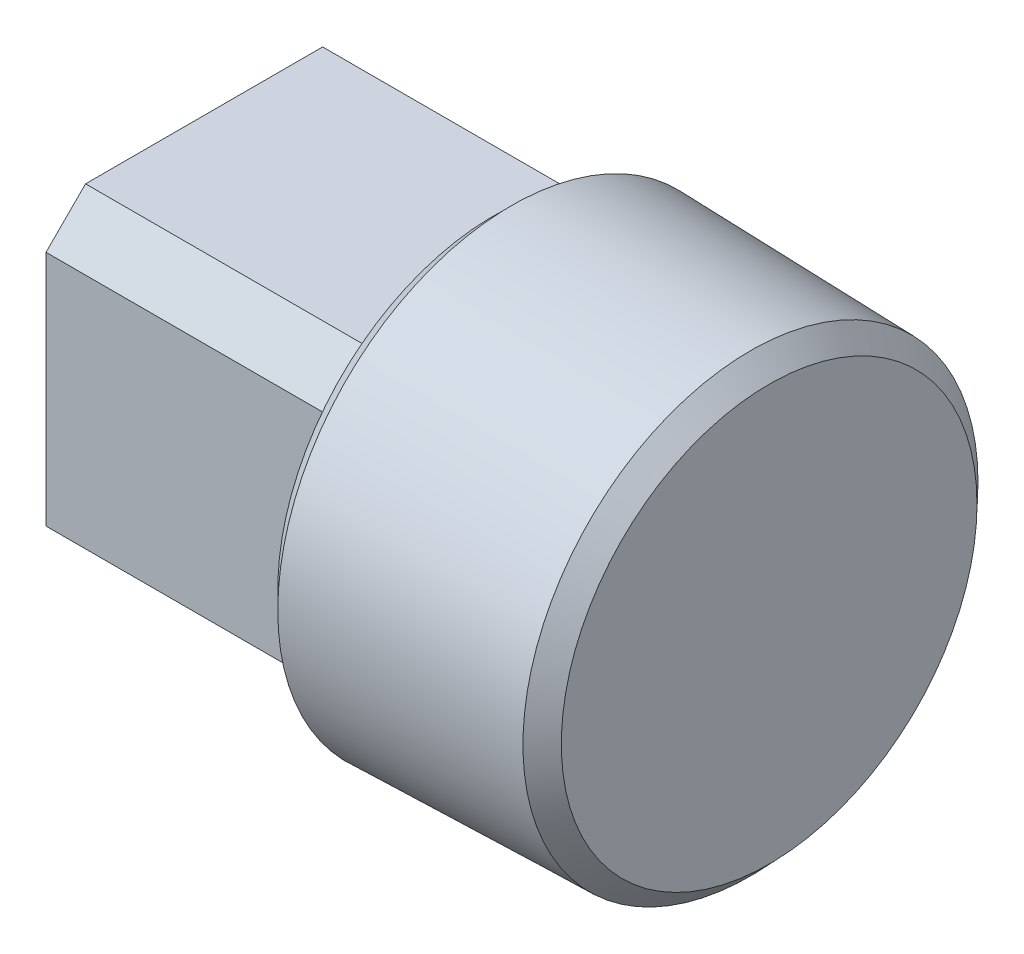
ISO-10303-21;
HEADER;
FILE_DESCRIPTION(('STEP AP214'),'2;1');
FILE_NAME('part.step','',(''),(''),'','','');
FILE_SCHEMA(('AUTOMOTIVE_DESIGN { 1 0 10303 214 1 1 1 1 }'));
ENDSEC;
DATA;
#1=APPLICATION_CONTEXT('core data for automotive mechanical design processes');
#2=APPLICATION_PROTOCOL_DEFINITION('international standard','automotive_design',2000,#1);
#3=PRODUCT_CONTEXT('',#1,'mechanical');
#4=PRODUCT('Part','Part','',(#3));
#5=PRODUCT_RELATED_PRODUCT_CATEGORY('part','',(#4));
#6=PRODUCT_DEFINITION_FORMATION('','',#4);
#7=PRODUCT_DEFINITION_CONTEXT('part definition',#1,'design');
#8=PRODUCT_DEFINITION('design','',#6,#7);
#9=PRODUCT_DEFINITION_SHAPE('','',#8);
#10=(LENGTH_UNIT() NAMED_UNIT(*) SI_UNIT(.MILLI.,.METRE.));
#11=(NAMED_UNIT(*) PLANE_ANGLE_UNIT() SI_UNIT($,.RADIAN.));
#12=(NAMED_UNIT(*) SI_UNIT($,.STERADIAN.) SOLID_ANGLE_UNIT());
#13=UNCERTAINTY_MEASURE_WITH_UNIT(LENGTH_MEASURE(1.E-05),#10,'distance_accuracy_value','');
#14=(GEOMETRIC_REPRESENTATION_CONTEXT(3) GLOBAL_UNCERTAINTY_ASSIGNED_CONTEXT((#13)) GLOBAL_UNIT_ASSIGNED_CONTEXT((#10,
#11,#12)) REPRESENTATION_CONTEXT('',''));
#15=CARTESIAN_POINT('',(0.,0.,0.));
#16=DIRECTION('',(0.,0.,1.));
#17=DIRECTION('',(1.,0.,0.));
#18=AXIS2_PLACEMENT_3D('',#15,#16,#17);
#19=CARTESIAN_POINT('',(0.253999999999999,0.,0.));
#20=DIRECTION('',(1.,0.,0.));
#21=DIRECTION('',(0.,0.,-1.));
#22=AXIS2_PLACEMENT_3D('',#19,#20,#21);
#23=PLANE('',#22);
#24=CARTESIAN_POINT('',(0.253999999999999,0.,0.));
#25=DIRECTION('',(1.,0.,0.));
#26=DIRECTION('',(0.,0.,-1.));
#27=AXIS2_PLACEMENT_3D('',#24,#25,#26);
#28=CIRCLE('',#27,8.13964463166595);
#29=CARTESIAN_POINT('',(0.253999999999999,0.,-8.13964463166595));
#30=VERTEX_POINT('',#29);
#31=EDGE_CURVE('E40',#30,#30,#28,.F.);
#32=ORIENTED_EDGE('',*,*,#31,.T.);
#33=EDGE_LOOP('',(#32));
#34=FACE_BOUND('',#33,.T.);
#35=DIRECTION('',(0.,0.,1.));
#36=VECTOR('',#35,1.);
#37=CARTESIAN_POINT('',(0.253999999999999,-5.969,-5.969));
#38=LINE('',#37,#36);
#39=CARTESIAN_POINT('',(0.253999999999999,-5.969,-4.47675));
#40=VERTEX_POINT('',#39);
#41=CARTESIAN_POINT('',(0.253999999999999,-5.969,4.47675));
#42=VERTEX_POINT('',#41);
#43=EDGE_CURVE('E124',#40,#42,#38,.T.);
#44=ORIENTED_EDGE('',*,*,#43,.F.);
#45=DIRECTION('',(0.,0.707106781186547,-0.707106781186548));
#46=VECTOR('',#45,1.);
#47=CARTESIAN_POINT('',(0.253999999999999,-4.47675,-5.969));
#48=LINE('',#47,#46);
#49=CARTESIAN_POINT('',(0.253999999999999,-4.47675,-5.969));
#50=VERTEX_POINT('',#49);
#51=EDGE_CURVE('E166',#40,#50,#48,.T.);
#52=ORIENTED_EDGE('',*,*,#51,.T.);
#53=DIRECTION('',(0.,-1.,0.));
#54=VECTOR('',#53,1.);
#55=CARTESIAN_POINT('',(0.253999999999999,-5.969,-5.969));
#56=LINE('',#55,#54);
#57=CARTESIAN_POINT('',(0.253999999999999,4.47675,-5.969));
#58=VERTEX_POINT('',#57);
#59=EDGE_CURVE('E11',#58,#50,#56,.T.);
#60=ORIENTED_EDGE('',*,*,#59,.F.);
#61=DIRECTION('',(0.,0.707106781186547,0.707106781186547));
#62=VECTOR('',#61,1.);
#63=CARTESIAN_POINT('',(0.253999999999999,4.47675,-5.969));
#64=LINE('',#63,#62);
#65=CARTESIAN_POINT('',(0.253999999999999,5.969,-4.47675));
#66=VERTEX_POINT('',#65);
#67=EDGE_CURVE('E121',#58,#66,#64,.T.);
#68=ORIENTED_EDGE('',*,*,#67,.T.);
#69=DIRECTION('',(0.,0.,-1.));
#70=VECTOR('',#69,1.);
#71=CARTESIAN_POINT('',(0.253999999999999,5.969,-5.969));
#72=LINE('',#71,#70);
#73=CARTESIAN_POINT('',(0.253999999999999,5.969,4.47675));
#74=VERTEX_POINT('',#73);
#75=EDGE_CURVE('E45',#74,#66,#72,.T.);
#76=ORIENTED_EDGE('',*,*,#75,.F.);
#77=DIRECTION('',(0.,-0.707106781186547,0.707106781186548));
#78=VECTOR('',#77,1.);
#79=CARTESIAN_POINT('',(0.253999999999999,5.969,4.47675));
#80=LINE('',#79,#78);
#81=CARTESIAN_POINT('',(0.253999999999999,4.47675,5.969));
#82=VERTEX_POINT('',#81);
#83=EDGE_CURVE('E101',#74,#82,#80,.T.);
#84=ORIENTED_EDGE('',*,*,#83,.T.);
#85=DIRECTION('',(0.,1.,0.));
#86=VECTOR('',#85,1.);
#87=CARTESIAN_POINT('',(0.253999999999999,-5.969,5.969));
#88=LINE('',#87,#86);
#89=CARTESIAN_POINT('',(0.253999999999999,-4.47675,5.969));
#90=VERTEX_POINT('',#89);
#91=EDGE_CURVE('E122',#90,#82,#88,.T.);
#92=ORIENTED_EDGE('',*,*,#91,.F.);
#93=DIRECTION('',(0.,-0.707106781186547,-0.707106781186548));
#94=VECTOR('',#93,1.);
#95=CARTESIAN_POINT('',(0.253999999999999,-4.47675,5.969));
#96=LINE('',#95,#94);
#97=EDGE_CURVE('E175',#90,#42,#96,.T.);
#98=ORIENTED_EDGE('',*,*,#97,.T.);
#99=EDGE_LOOP('',(#44,#52,#60,#68,#76,#84,#92,#98));
#100=FACE_BOUND('',#99,.T.);
#101=ADVANCED_FACE('F36',(#34,#100),#23,.F.);
#102=CARTESIAN_POINT('',(10.668,0.,0.));
#103=DIRECTION('',(-1.,0.,0.));
#104=DIRECTION('',(0.,0.,-1.));
#105=AXIS2_PLACEMENT_3D('',#102,#103,#104);
#106=CONICAL_SURFACE('',#105,8.5725,0.026179938779915);
#107=CARTESIAN_POINT('',(9.96268622071167,0.,0.));
#108=DIRECTION('',(1.,0.,0.));
#109=DIRECTION('',(0.,0.,-1.));
#110=AXIS2_PLACEMENT_3D('',#107,#108,#109);
#111=CIRCLE('',#110,8.59096929130611);
#112=CARTESIAN_POINT('',(9.96268622071167,0.,-8.59096929130611));
#113=VERTEX_POINT('',#112);
#114=EDGE_CURVE('E133',#113,#113,#111,.F.);
#115=ORIENTED_EDGE('',*,*,#114,.T.);
#116=EDGE_LOOP('',(#115));
#117=FACE_BOUND('',#116,.T.);
#118=CARTESIAN_POINT('',(0.941551388813308,0.,0.));
#119=DIRECTION('',(-1.,0.,0.));
#120=DIRECTION('',(0.,0.,1.));
#121=AXIS2_PLACEMENT_3D('',#118,#119,#120);
#122=CIRCLE('',#121,8.82719602047926);
#123=CARTESIAN_POINT('',(0.941551388813308,0.,8.82719602047926));
#124=VERTEX_POINT('',#123);
#125=EDGE_CURVE('E131',#124,#124,#122,.F.);
#126=ORIENTED_EDGE('',*,*,#125,.T.);
#127=EDGE_LOOP('',(#126));
#128=FACE_BOUND('',#127,.T.);
#129=ADVANCED_FACE('F209',(#117,#128),#106,.T.);
#130=CARTESIAN_POINT('',(10.668,0.,0.));
#131=DIRECTION('',(1.,0.,0.));
#132=DIRECTION('',(0.,0.,-1.));
#133=AXIS2_PLACEMENT_3D('',#130,#131,#132);
#134=PLANE('',#133);
#135=CARTESIAN_POINT('',(10.668,0.,0.));
#136=DIRECTION('',(1.,0.,0.));
#137=DIRECTION('',(0.,0.,-1.));
#138=AXIS2_PLACEMENT_3D('',#135,#136,#137);
#139=CIRCLE('',#138,7.84772364860529);
#140=CARTESIAN_POINT('',(10.668,0.,-7.84772364860529));
#141=VERTEX_POINT('',#140);
#142=EDGE_CURVE('E128',#141,#141,#139,.T.);
#143=ORIENTED_EDGE('',*,*,#142,.T.);
#144=EDGE_LOOP('',(#143));
#145=FACE_BOUND('',#144,.T.);
#146=ADVANCED_FACE('F214',(#145),#134,.T.);
#147=CARTESIAN_POINT('',(10.668,0.,0.));
#148=DIRECTION('',(-1.,0.,0.));
#149=DIRECTION('',(0.,0.,1.));
#150=AXIS2_PLACEMENT_3D('',#147,#148,#149);
#151=CONICAL_SURFACE('',#150,7.84772364860529,0.811578102177362);
#152=ORIENTED_EDGE('',*,*,#114,.F.);
#153=EDGE_LOOP('',(#152));
#154=FACE_BOUND('',#153,.T.);
#155=ORIENTED_EDGE('',*,*,#142,.F.);
#156=EDGE_LOOP('',(#155));
#157=FACE_BOUND('',#156,.T.);
#158=ADVANCED_FACE('F220',(#154,#157),#151,.T.);
#159=CARTESIAN_POINT('',(0.941551388813308,0.,0.));
#160=DIRECTION('',(1.,0.,0.));
#161=DIRECTION('',(0.,0.,-1.));
#162=AXIS2_PLACEMENT_3D('',#159,#160,#161);
#163=CONICAL_SURFACE('',#162,8.82719602047926,0.785398163397448);
#164=ORIENTED_EDGE('',*,*,#31,.F.);
#165=EDGE_LOOP('',(#164));
#166=FACE_BOUND('',#165,.T.);
#167=ORIENTED_EDGE('',*,*,#125,.F.);
#168=EDGE_LOOP('',(#167));
#169=FACE_BOUND('',#168,.T.);
#170=ADVANCED_FACE('F38',(#166,#169),#163,.T.);
#171=CARTESIAN_POINT('',(-10.668,-5.969,-5.969));
#172=DIRECTION('',(0.,0.,1.));
#173=DIRECTION('',(0.,-1.,0.));
#174=AXIS2_PLACEMENT_3D('',#171,#172,#173);
#175=PLANE('',#174);
#176=ORIENTED_EDGE('',*,*,#59,.T.);
#177=DIRECTION('',(-1.,0.,0.));
#178=VECTOR('',#177,1.);
#179=CARTESIAN_POINT('',(0.253999999999999,-4.47675,-5.969));
#180=LINE('',#179,#178);
#181=CARTESIAN_POINT('',(-10.668,-4.47675,-5.969));
#182=VERTEX_POINT('',#181);
#183=EDGE_CURVE('E162',#50,#182,#180,.T.);
#184=ORIENTED_EDGE('',*,*,#183,.T.);
#185=DIRECTION('',(0.,-1.,0.));
#186=VECTOR('',#185,1.);
#187=CARTESIAN_POINT('',(-10.668,-5.969,-5.969));
#188=LINE('',#187,#186);
#189=CARTESIAN_POINT('',(-10.668,4.47675,-5.969));
#190=VERTEX_POINT('',#189);
#191=EDGE_CURVE('E152',#190,#182,#188,.T.);
#192=ORIENTED_EDGE('',*,*,#191,.F.);
#193=DIRECTION('',(-1.,0.,0.));
#194=VECTOR('',#193,1.);
#195=CARTESIAN_POINT('',(0.253999999999999,4.47675,-5.969));
#196=LINE('',#195,#194);
#197=EDGE_CURVE('E156',#58,#190,#196,.T.);
#198=ORIENTED_EDGE('',*,*,#197,.F.);
#199=EDGE_LOOP('',(#176,#184,#192,#198));
#200=FACE_BOUND('',#199,.T.);
#201=ADVANCED_FACE('F194',(#200),#175,.F.);
#202=CARTESIAN_POINT('',(-10.668,-5.969,-5.969));
#203=DIRECTION('',(0.,1.,0.));
#204=DIRECTION('',(0.,0.,1.));
#205=AXIS2_PLACEMENT_3D('',#202,#203,#204);
#206=PLANE('',#205);
#207=ORIENTED_EDGE('',*,*,#43,.T.);
#208=DIRECTION('',(-1.,0.,0.));
#209=VECTOR('',#208,1.);
#210=CARTESIAN_POINT('',(0.253999999999999,-5.969,4.47675));
#211=LINE('',#210,#209);
#212=CARTESIAN_POINT('',(-10.668,-5.969,4.47675));
#213=VERTEX_POINT('',#212);
#214=EDGE_CURVE('E171',#42,#213,#211,.T.);
#215=ORIENTED_EDGE('',*,*,#214,.T.);
#216=DIRECTION('',(0.,0.,1.));
#217=VECTOR('',#216,1.);
#218=CARTESIAN_POINT('',(-10.668,-5.969,-5.969));
#219=LINE('',#218,#217);
#220=CARTESIAN_POINT('',(-10.668,-5.969,-4.47675));
#221=VERTEX_POINT('',#220);
#222=EDGE_CURVE('E149',#221,#213,#219,.T.);
#223=ORIENTED_EDGE('',*,*,#222,.F.);
#224=DIRECTION('',(-1.,0.,0.));
#225=VECTOR('',#224,1.);
#226=CARTESIAN_POINT('',(0.253999999999999,-5.969,-4.47675));
#227=LINE('',#226,#225);
#228=EDGE_CURVE('E164',#40,#221,#227,.T.);
#229=ORIENTED_EDGE('',*,*,#228,.F.);
#230=EDGE_LOOP('',(#207,#215,#223,#229));
#231=FACE_BOUND('',#230,.T.);
#232=ADVANCED_FACE('F190',(#231),#206,.F.);
#233=CARTESIAN_POINT('',(-10.668,-5.969,5.969));
#234=DIRECTION('',(0.,0.,-1.));
#235=DIRECTION('',(-1.,0.,0.));
#236=AXIS2_PLACEMENT_3D('',#233,#234,#235);
#237=PLANE('',#236);
#238=ORIENTED_EDGE('',*,*,#91,.T.);
#239=DIRECTION('',(-1.,0.,0.));
#240=VECTOR('',#239,1.);
#241=CARTESIAN_POINT('',(0.253999999999999,4.47675,5.969));
#242=LINE('',#241,#240);
#243=CARTESIAN_POINT('',(-10.668,4.47675,5.969));
#244=VERTEX_POINT('',#243);
#245=EDGE_CURVE('E104',#82,#244,#242,.T.);
#246=ORIENTED_EDGE('',*,*,#245,.T.);
#247=DIRECTION('',(0.,1.,0.));
#248=VECTOR('',#247,1.);
#249=CARTESIAN_POINT('',(-10.668,-5.969,5.969));
#250=LINE('',#249,#248);
#251=CARTESIAN_POINT('',(-10.668,-4.47675,5.969));
#252=VERTEX_POINT('',#251);
#253=EDGE_CURVE('E146',#252,#244,#250,.T.);
#254=ORIENTED_EDGE('',*,*,#253,.F.);
#255=DIRECTION('',(-1.,0.,0.));
#256=VECTOR('',#255,1.);
#257=CARTESIAN_POINT('',(0.253999999999999,-4.47675,5.969));
#258=LINE('',#257,#256);
#259=EDGE_CURVE('E61',#90,#252,#258,.T.);
#260=ORIENTED_EDGE('',*,*,#259,.F.);
#261=EDGE_LOOP('',(#238,#246,#254,#260));
#262=FACE_BOUND('',#261,.T.);
#263=ADVANCED_FACE('F185',(#262),#237,.F.);
#264=CARTESIAN_POINT('',(-10.668,5.969,-5.969));
#265=DIRECTION('',(0.,-1.,0.));
#266=DIRECTION('',(0.,0.,-1.));
#267=AXIS2_PLACEMENT_3D('',#264,#265,#266);
#268=PLANE('',#267);
#269=DIRECTION('',(0.,0.,-1.));
#270=VECTOR('',#269,1.);
#271=CARTESIAN_POINT('',(-10.668,5.969,-5.969));
#272=LINE('',#271,#270);
#273=CARTESIAN_POINT('',(-10.668,5.969,4.47675));
#274=VERTEX_POINT('',#273);
#275=CARTESIAN_POINT('',(-10.668,5.969,-4.47675));
#276=VERTEX_POINT('',#275);
#277=EDGE_CURVE('E116',#274,#276,#272,.T.);
#278=ORIENTED_EDGE('',*,*,#277,.F.);
#279=DIRECTION('',(-1.,0.,0.));
#280=VECTOR('',#279,1.);
#281=CARTESIAN_POINT('',(0.253999999999999,5.969,4.47675));
#282=LINE('',#281,#280);
#283=EDGE_CURVE('E53',#74,#274,#282,.T.);
#284=ORIENTED_EDGE('',*,*,#283,.F.);
#285=ORIENTED_EDGE('',*,*,#75,.T.);
#286=DIRECTION('',(-1.,0.,0.));
#287=VECTOR('',#286,1.);
#288=CARTESIAN_POINT('',(0.253999999999999,5.969,-4.47675));
#289=LINE('',#288,#287);
#290=EDGE_CURVE('E155',#66,#276,#289,.T.);
#291=ORIENTED_EDGE('',*,*,#290,.T.);
#292=EDGE_LOOP('',(#278,#284,#285,#291));
#293=FACE_BOUND('',#292,.T.);
#294=ADVANCED_FACE('F113',(#293),#268,.F.);
#295=CARTESIAN_POINT('',(-10.668,5.969,-5.969));
#296=DIRECTION('',(1.,0.,0.));
#297=DIRECTION('',(0.,0.,-1.));
#298=AXIS2_PLACEMENT_3D('',#295,#296,#297);
#299=PLANE('',#298);
#300=ORIENTED_EDGE('',*,*,#253,.T.);
#301=DIRECTION('',(0.,-0.707106781186547,0.707106781186548));
#302=VECTOR('',#301,1.);
#303=CARTESIAN_POINT('',(-10.668,5.969,4.47675));
#304=LINE('',#303,#302);
#305=EDGE_CURVE('E109',#274,#244,#304,.T.);
#306=ORIENTED_EDGE('',*,*,#305,.F.);
#307=ORIENTED_EDGE('',*,*,#277,.T.);
#308=DIRECTION('',(0.,0.707106781186547,0.707106781186547));
#309=VECTOR('',#308,1.);
#310=CARTESIAN_POINT('',(-10.668,4.47675,-5.969));
#311=LINE('',#310,#309);
#312=EDGE_CURVE('E159',#190,#276,#311,.T.);
#313=ORIENTED_EDGE('',*,*,#312,.F.);
#314=ORIENTED_EDGE('',*,*,#191,.T.);
#315=DIRECTION('',(0.,0.707106781186547,-0.707106781186548));
#316=VECTOR('',#315,1.);
#317=CARTESIAN_POINT('',(-10.668,-4.47675,-5.969));
#318=LINE('',#317,#316);
#319=EDGE_CURVE('E169',#221,#182,#318,.T.);
#320=ORIENTED_EDGE('',*,*,#319,.F.);
#321=ORIENTED_EDGE('',*,*,#222,.T.);
#322=DIRECTION('',(0.,-0.707106781186547,-0.707106781186548));
#323=VECTOR('',#322,1.);
#324=CARTESIAN_POINT('',(-10.668,-4.47675,5.969));
#325=LINE('',#324,#323);
#326=EDGE_CURVE('E177',#252,#213,#325,.T.);
#327=ORIENTED_EDGE('',*,*,#326,.F.);
#328=EDGE_LOOP('',(#300,#306,#307,#313,#314,#320,#321,#327));
#329=FACE_BOUND('',#328,.T.);
#330=ADVANCED_FACE('F186',(#329),#299,.F.);
#331=CARTESIAN_POINT('',(0.253999999999999,4.47675,-5.969));
#332=DIRECTION('',(0.,-0.707106781186547,0.707106781186547));
#333=DIRECTION('',(0.,-0.707106781186548,-0.707106781186548));
#334=AXIS2_PLACEMENT_3D('',#331,#332,#333);
#335=PLANE('',#334);
#336=ORIENTED_EDGE('',*,*,#312,.T.);
#337=ORIENTED_EDGE('',*,*,#290,.F.);
#338=ORIENTED_EDGE('',*,*,#67,.F.);
#339=ORIENTED_EDGE('',*,*,#197,.T.);
#340=EDGE_LOOP('',(#336,#337,#338,#339));
#341=FACE_BOUND('',#340,.T.);
#342=ADVANCED_FACE('F198',(#341),#335,.F.);
#343=CARTESIAN_POINT('',(0.253999999999999,-4.47675,-5.969));
#344=DIRECTION('',(0.,0.707106781186548,0.707106781186547));
#345=DIRECTION('',(0.,-0.707106781186547,0.707106781186548));
#346=AXIS2_PLACEMENT_3D('',#343,#344,#345);
#347=PLANE('',#346);
#348=ORIENTED_EDGE('',*,*,#319,.T.);
#349=ORIENTED_EDGE('',*,*,#183,.F.);
#350=ORIENTED_EDGE('',*,*,#51,.F.);
#351=ORIENTED_EDGE('',*,*,#228,.T.);
#352=EDGE_LOOP('',(#348,#349,#350,#351));
#353=FACE_BOUND('',#352,.T.);
#354=ADVANCED_FACE('F199',(#353),#347,.F.);
#355=CARTESIAN_POINT('',(0.253999999999999,-4.47675,5.969));
#356=DIRECTION('',(0.,0.707106781186548,-0.707106781186547));
#357=DIRECTION('',(0.,0.707106781186547,0.707106781186548));
#358=AXIS2_PLACEMENT_3D('',#355,#356,#357);
#359=PLANE('',#358);
#360=ORIENTED_EDGE('',*,*,#326,.T.);
#361=ORIENTED_EDGE('',*,*,#214,.F.);
#362=ORIENTED_EDGE('',*,*,#97,.F.);
#363=ORIENTED_EDGE('',*,*,#259,.T.);
#364=EDGE_LOOP('',(#360,#361,#362,#363));
#365=FACE_BOUND('',#364,.T.);
#366=ADVANCED_FACE('F189',(#365),#359,.F.);
#367=CARTESIAN_POINT('',(0.253999999999999,5.969,4.47675));
#368=DIRECTION('',(0.,-0.707106781186548,-0.707106781186547));
#369=DIRECTION('',(0.,0.707106781186547,-0.707106781186548));
#370=AXIS2_PLACEMENT_3D('',#367,#368,#369);
#371=PLANE('',#370);
#372=ORIENTED_EDGE('',*,*,#305,.T.);
#373=ORIENTED_EDGE('',*,*,#245,.F.);
#374=ORIENTED_EDGE('',*,*,#83,.F.);
#375=ORIENTED_EDGE('',*,*,#283,.T.);
#376=EDGE_LOOP('',(#372,#373,#374,#375));
#377=FACE_BOUND('',#376,.T.);
#378=ADVANCED_FACE('F102',(#377),#371,.F.);
#379=CLOSED_SHELL('',(#101,#129,#146,#158,#170,#201,#232,#263,#294,#330,#342,#354,#366,#378));
#380=MANIFOLD_SOLID_BREP('B2',#379);
#381=ADVANCED_BREP_SHAPE_REPRESENTATION('',(#18,#380),#14);
#382=SHAPE_DEFINITION_REPRESENTATION(#9,#381);
ENDSEC;
END-ISO-10303-21;
